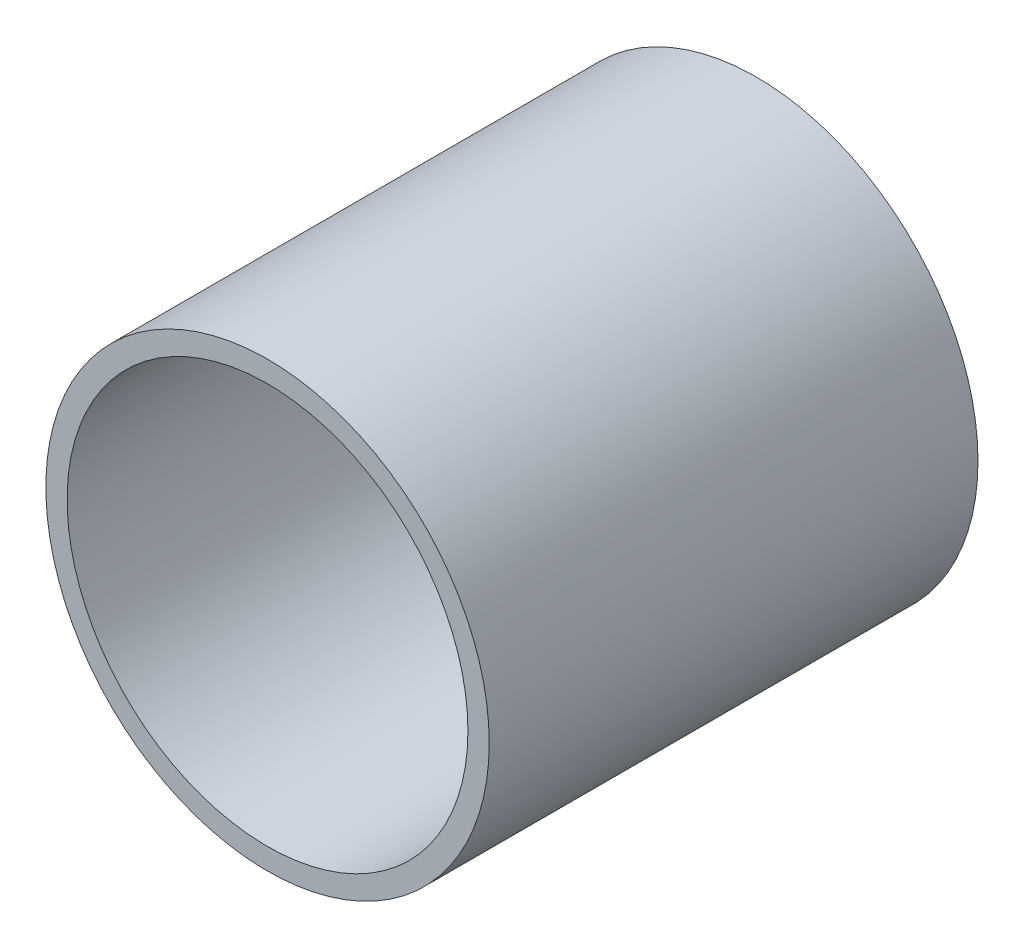
ISO-10303-21;
HEADER;
FILE_DESCRIPTION(('STEP AP214'),'2;1');
FILE_NAME('part.step','',(''),(''),'','','');
FILE_SCHEMA(('AUTOMOTIVE_DESIGN { 1 0 10303 214 1 1 1 1 }'));
ENDSEC;
DATA;
#1=APPLICATION_CONTEXT('core data for automotive mechanical design processes');
#2=APPLICATION_PROTOCOL_DEFINITION('international standard','automotive_design',2000,#1);
#3=PRODUCT_CONTEXT('',#1,'mechanical');
#4=PRODUCT('Part','Part','',(#3));
#5=PRODUCT_RELATED_PRODUCT_CATEGORY('part','',(#4));
#6=PRODUCT_DEFINITION_FORMATION('','',#4);
#7=PRODUCT_DEFINITION_CONTEXT('part definition',#1,'design');
#8=PRODUCT_DEFINITION('design','',#6,#7);
#9=PRODUCT_DEFINITION_SHAPE('','',#8);
#10=(LENGTH_UNIT() NAMED_UNIT(*) SI_UNIT(.MILLI.,.METRE.));
#11=(NAMED_UNIT(*) PLANE_ANGLE_UNIT() SI_UNIT($,.RADIAN.));
#12=(NAMED_UNIT(*) SI_UNIT($,.STERADIAN.) SOLID_ANGLE_UNIT());
#13=UNCERTAINTY_MEASURE_WITH_UNIT(LENGTH_MEASURE(1.E-05),#10,'distance_accuracy_value','');
#14=(GEOMETRIC_REPRESENTATION_CONTEXT(3) GLOBAL_UNCERTAINTY_ASSIGNED_CONTEXT((#13)) GLOBAL_UNIT_ASSIGNED_CONTEXT((#10,
#11,#12)) REPRESENTATION_CONTEXT('',''));
#15=CARTESIAN_POINT('',(0.,0.,0.));
#16=DIRECTION('',(0.,0.,1.));
#17=DIRECTION('',(1.,0.,0.));
#18=AXIS2_PLACEMENT_3D('',#15,#16,#17);
#19=CARTESIAN_POINT('',(0.,0.,70.));
#20=DIRECTION('',(0.,0.,1.));
#21=DIRECTION('',(1.,0.,0.));
#22=AXIS2_PLACEMENT_3D('',#19,#20,#21);
#23=PLANE('',#22);
#24=CARTESIAN_POINT('',(0.,0.,70.));
#25=DIRECTION('',(0.,0.,1.));
#26=DIRECTION('',(1.,0.,0.));
#27=AXIS2_PLACEMENT_3D('',#24,#25,#26);
#28=CIRCLE('',#27,31.75);
#29=CARTESIAN_POINT('',(31.75,0.,70.));
#30=VERTEX_POINT('',#29);
#31=EDGE_CURVE('E10',#30,#30,#28,.T.);
#32=ORIENTED_EDGE('',*,*,#31,.T.);
#33=EDGE_LOOP('',(#32));
#34=FACE_BOUND('',#33,.T.);
#35=CARTESIAN_POINT('',(0.,0.,70.));
#36=DIRECTION('',(0.,0.,1.));
#37=DIRECTION('',(1.,0.,0.));
#38=AXIS2_PLACEMENT_3D('',#35,#36,#37);
#39=CIRCLE('',#38,28.7);
#40=CARTESIAN_POINT('',(28.7,0.,70.));
#41=VERTEX_POINT('',#40);
#42=EDGE_CURVE('E42',#41,#41,#39,.T.);
#43=ORIENTED_EDGE('',*,*,#42,.F.);
#44=EDGE_LOOP('',(#43));
#45=FACE_BOUND('',#44,.T.);
#46=ADVANCED_FACE('F31',(#34,#45),#23,.T.);
#47=CARTESIAN_POINT('',(0.,0.,0.));
#48=DIRECTION('',(0.,0.,1.));
#49=DIRECTION('',(1.,0.,0.));
#50=AXIS2_PLACEMENT_3D('',#47,#48,#49);
#51=PLANE('',#50);
#52=CARTESIAN_POINT('',(0.,0.,0.));
#53=DIRECTION('',(0.,0.,1.));
#54=DIRECTION('',(1.,0.,0.));
#55=AXIS2_PLACEMENT_3D('',#52,#53,#54);
#56=CIRCLE('',#55,31.75);
#57=CARTESIAN_POINT('',(31.75,0.,0.));
#58=VERTEX_POINT('',#57);
#59=EDGE_CURVE('E35',#58,#58,#56,.T.);
#60=ORIENTED_EDGE('',*,*,#59,.F.);
#61=EDGE_LOOP('',(#60));
#62=FACE_BOUND('',#61,.T.);
#63=CARTESIAN_POINT('',(0.,0.,0.));
#64=DIRECTION('',(0.,0.,1.));
#65=DIRECTION('',(1.,0.,0.));
#66=AXIS2_PLACEMENT_3D('',#63,#64,#65);
#67=CIRCLE('',#66,28.7);
#68=CARTESIAN_POINT('',(28.7,0.,0.));
#69=VERTEX_POINT('',#68);
#70=EDGE_CURVE('E44',#69,#69,#67,.T.);
#71=ORIENTED_EDGE('',*,*,#70,.T.);
#72=EDGE_LOOP('',(#71));
#73=FACE_BOUND('',#72,.T.);
#74=ADVANCED_FACE('F54',(#62,#73),#51,.F.);
#75=CARTESIAN_POINT('',(0.,0.,70.));
#76=DIRECTION('',(0.,0.,-1.));
#77=DIRECTION('',(-1.,0.,0.));
#78=AXIS2_PLACEMENT_3D('',#75,#76,#77);
#79=CYLINDRICAL_SURFACE('',#78,31.75);
#80=ORIENTED_EDGE('',*,*,#31,.F.);
#81=EDGE_LOOP('',(#80));
#82=FACE_BOUND('',#81,.T.);
#83=ORIENTED_EDGE('',*,*,#59,.T.);
#84=EDGE_LOOP('',(#83));
#85=FACE_BOUND('',#84,.T.);
#86=ADVANCED_FACE('F33',(#82,#85),#79,.T.);
#87=CARTESIAN_POINT('',(0.,0.,70.));
#88=DIRECTION('',(0.,0.,-1.));
#89=DIRECTION('',(-1.,0.,0.));
#90=AXIS2_PLACEMENT_3D('',#87,#88,#89);
#91=CYLINDRICAL_SURFACE('',#90,28.7);
#92=ORIENTED_EDGE('',*,*,#42,.T.);
#93=EDGE_LOOP('',(#92));
#94=FACE_BOUND('',#93,.T.);
#95=ORIENTED_EDGE('',*,*,#70,.F.);
#96=EDGE_LOOP('',(#95));
#97=FACE_BOUND('',#96,.T.);
#98=ADVANCED_FACE('F50',(#94,#97),#91,.F.);
#99=CLOSED_SHELL('',(#46,#74,#86,#98));
#100=MANIFOLD_SOLID_BREP('B2',#99);
#101=ADVANCED_BREP_SHAPE_REPRESENTATION('',(#18,#100),#14);
#102=SHAPE_DEFINITION_REPRESENTATION(#9,#101);
ENDSEC;
END-ISO-10303-21;
